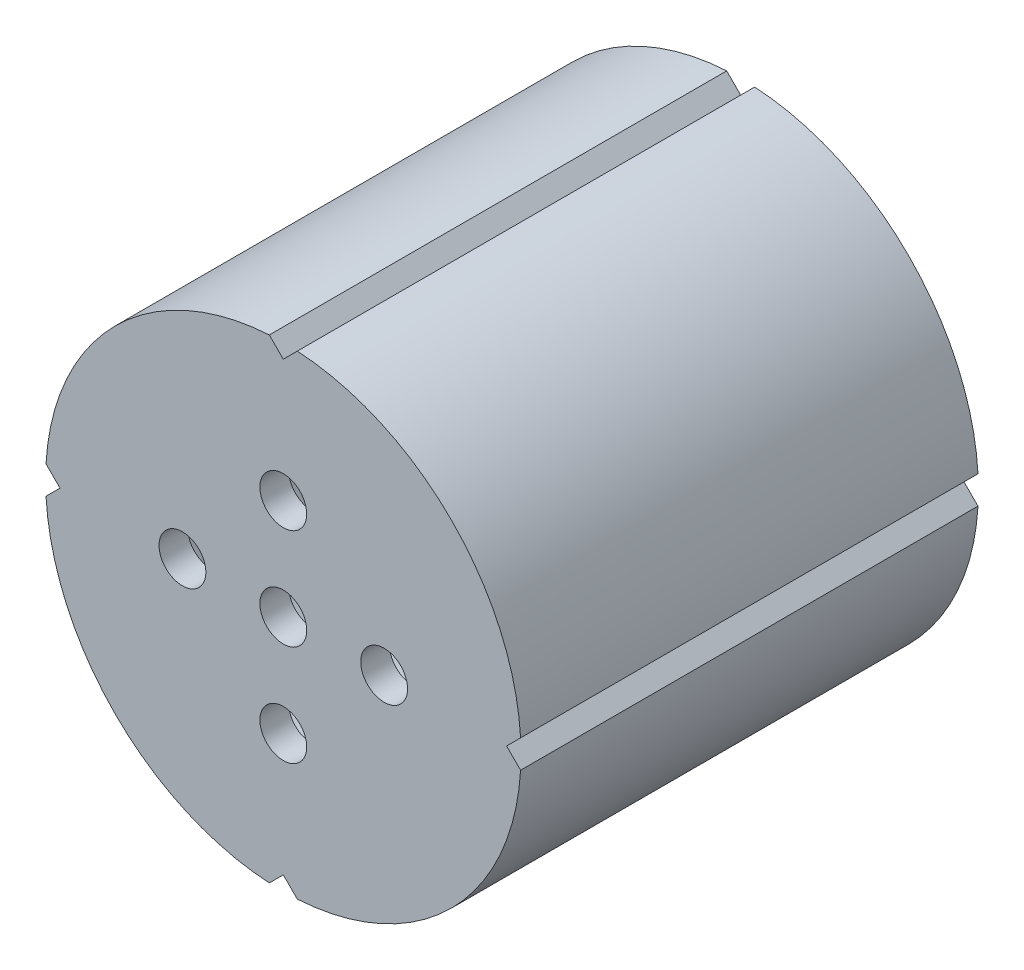
ISO-10303-21;
HEADER;
FILE_DESCRIPTION(('STEP AP214'),'2;1');
FILE_NAME('part.step','',(''),(''),'','','');
FILE_SCHEMA(('AUTOMOTIVE_DESIGN { 1 0 10303 214 1 1 1 1 }'));
ENDSEC;
DATA;
#1=APPLICATION_CONTEXT('core data for automotive mechanical design processes');
#2=APPLICATION_PROTOCOL_DEFINITION('international standard','automotive_design',2000,#1);
#3=PRODUCT_CONTEXT('',#1,'mechanical');
#4=PRODUCT('Part','Part','',(#3));
#5=PRODUCT_RELATED_PRODUCT_CATEGORY('part','',(#4));
#6=PRODUCT_DEFINITION_FORMATION('','',#4);
#7=PRODUCT_DEFINITION_CONTEXT('part definition',#1,'design');
#8=PRODUCT_DEFINITION('design','',#6,#7);
#9=PRODUCT_DEFINITION_SHAPE('','',#8);
#10=(LENGTH_UNIT() NAMED_UNIT(*) SI_UNIT(.MILLI.,.METRE.));
#11=(NAMED_UNIT(*) PLANE_ANGLE_UNIT() SI_UNIT($,.RADIAN.));
#12=(NAMED_UNIT(*) SI_UNIT($,.STERADIAN.) SOLID_ANGLE_UNIT());
#13=UNCERTAINTY_MEASURE_WITH_UNIT(LENGTH_MEASURE(1.E-05),#10,'distance_accuracy_value','');
#14=(GEOMETRIC_REPRESENTATION_CONTEXT(3) GLOBAL_UNCERTAINTY_ASSIGNED_CONTEXT((#13)) GLOBAL_UNIT_ASSIGNED_CONTEXT((#10,
#11,#12)) REPRESENTATION_CONTEXT('',''));
#15=CARTESIAN_POINT('',(0.,0.,0.));
#16=DIRECTION('',(0.,0.,1.));
#17=DIRECTION('',(1.,0.,0.));
#18=AXIS2_PLACEMENT_3D('',#15,#16,#17);
#19=CARTESIAN_POINT('',(4.97633536173072,-25.8000000000002,0.));
#20=DIRECTION('',(0.,0.,1.));
#21=DIRECTION('',(1.,0.,0.));
#22=AXIS2_PLACEMENT_3D('',#19,#20,#21);
#23=PLANE('',#22);
#24=CARTESIAN_POINT('',(4.97633536173072,-32.8000000000003,0.));
#25=DIRECTION('',(0.,0.,1.));
#26=DIRECTION('',(1.,0.,0.));
#27=AXIS2_PLACEMENT_3D('',#24,#25,#26);
#28=CIRCLE('',#27,1.625);
#29=CARTESIAN_POINT('',(6.60133536173072,-32.8000000000003,0.));
#30=VERTEX_POINT('',#29);
#31=EDGE_CURVE('E176',#30,#30,#28,.T.);
#32=ORIENTED_EDGE('',*,*,#31,.T.);
#33=EDGE_LOOP('',(#32));
#34=FACE_BOUND('',#33,.T.);
#35=CARTESIAN_POINT('',(11.9763353617307,-25.8000000000002,0.));
#36=DIRECTION('',(0.,0.,1.));
#37=DIRECTION('',(1.,0.,0.));
#38=AXIS2_PLACEMENT_3D('',#35,#36,#37);
#39=CIRCLE('',#38,1.625);
#40=CARTESIAN_POINT('',(13.6013353617307,-25.8000000000002,0.));
#41=VERTEX_POINT('',#40);
#42=EDGE_CURVE('E180',#41,#41,#39,.T.);
#43=ORIENTED_EDGE('',*,*,#42,.T.);
#44=EDGE_LOOP('',(#43));
#45=FACE_BOUND('',#44,.T.);
#46=CARTESIAN_POINT('',(4.97633536173072,-18.8000000000002,0.));
#47=DIRECTION('',(0.,0.,1.));
#48=DIRECTION('',(1.,0.,0.));
#49=AXIS2_PLACEMENT_3D('',#46,#47,#48);
#50=CIRCLE('',#49,1.625);
#51=CARTESIAN_POINT('',(6.60133536173072,-18.8000000000002,0.));
#52=VERTEX_POINT('',#51);
#53=EDGE_CURVE('E186',#52,#52,#50,.T.);
#54=ORIENTED_EDGE('',*,*,#53,.T.);
#55=EDGE_LOOP('',(#54));
#56=FACE_BOUND('',#55,.T.);
#57=CARTESIAN_POINT('',(-2.02366463826928,-25.8000000000002,0.));
#58=DIRECTION('',(0.,0.,1.));
#59=DIRECTION('',(1.,0.,0.));
#60=AXIS2_PLACEMENT_3D('',#57,#58,#59);
#61=CIRCLE('',#60,1.625);
#62=CARTESIAN_POINT('',(-0.398664638269278,-25.8000000000002,0.));
#63=VERTEX_POINT('',#62);
#64=EDGE_CURVE('E192',#63,#63,#61,.T.);
#65=ORIENTED_EDGE('',*,*,#64,.T.);
#66=EDGE_LOOP('',(#65));
#67=FACE_BOUND('',#66,.T.);
#68=CARTESIAN_POINT('',(4.97633536173072,-25.8000000000002,0.));
#69=DIRECTION('',(0.,0.,1.));
#70=DIRECTION('',(1.,0.,0.));
#71=AXIS2_PLACEMENT_3D('',#68,#69,#70);
#72=CIRCLE('',#71,1.625);
#73=CARTESIAN_POINT('',(6.60133536173072,-25.8000000000002,0.));
#74=VERTEX_POINT('',#73);
#75=EDGE_CURVE('E198',#74,#74,#72,.T.);
#76=ORIENTED_EDGE('',*,*,#75,.T.);
#77=EDGE_LOOP('',(#76));
#78=FACE_BOUND('',#77,.T.);
#79=CARTESIAN_POINT('',(4.97633536173074,-25.8000000000003,0.));
#80=DIRECTION('',(0.,0.,-1.));
#81=DIRECTION('',(-1.,0.,0.));
#82=AXIS2_PLACEMENT_3D('',#79,#80,#81);
#83=CIRCLE('',#82,14.9999999999991);
#84=CARTESIAN_POINT('',(-10.0236646382684,-25.8000000000003,0.));
#85=VERTEX_POINT('',#84);
#86=EDGE_CURVE('E147',#85,#85,#83,.T.);
#87=ORIENTED_EDGE('',*,*,#86,.T.);
#88=EDGE_LOOP('',(#87));
#89=FACE_BOUND('',#88,.T.);
#90=ADVANCED_FACE('F33',(#34,#45,#56,#67,#78,#89),#23,.F.);
#91=CARTESIAN_POINT('',(4.97633536173072,-25.8000000000002,2.));
#92=DIRECTION('',(0.,0.,1.));
#93=DIRECTION('',(1.,0.,0.));
#94=AXIS2_PLACEMENT_3D('',#91,#92,#93);
#95=PLANE('',#94);
#96=CARTESIAN_POINT('',(11.9763353617307,-25.8000000000002,2.));
#97=DIRECTION('',(0.,0.,1.));
#98=DIRECTION('',(1.,0.,0.));
#99=AXIS2_PLACEMENT_3D('',#96,#97,#98);
#100=CIRCLE('',#99,1.625);
#101=CARTESIAN_POINT('',(13.6013353617307,-25.8000000000002,2.));
#102=VERTEX_POINT('',#101);
#103=EDGE_CURVE('E183',#102,#102,#100,.T.);
#104=ORIENTED_EDGE('',*,*,#103,.F.);
#105=EDGE_LOOP('',(#104));
#106=FACE_BOUND('',#105,.T.);
#107=CARTESIAN_POINT('',(-2.02366463826928,-25.8000000000002,2.));
#108=DIRECTION('',(0.,0.,1.));
#109=DIRECTION('',(1.,0.,0.));
#110=AXIS2_PLACEMENT_3D('',#107,#108,#109);
#111=CIRCLE('',#110,1.625);
#112=CARTESIAN_POINT('',(-0.398664638269278,-25.8000000000002,2.));
#113=VERTEX_POINT('',#112);
#114=EDGE_CURVE('E195',#113,#113,#111,.T.);
#115=ORIENTED_EDGE('',*,*,#114,.F.);
#116=EDGE_LOOP('',(#115));
#117=FACE_BOUND('',#116,.T.);
#118=CARTESIAN_POINT('',(4.97633536173072,-25.8000000000002,2.));
#119=DIRECTION('',(0.,0.,1.));
#120=DIRECTION('',(1.,0.,0.));
#121=AXIS2_PLACEMENT_3D('',#118,#119,#120);
#122=CIRCLE('',#121,16.5);
#123=CARTESIAN_POINT('',(4.00495359047452,-9.32861822874404,2.));
#124=VERTEX_POINT('',#123);
#125=CARTESIAN_POINT('',(-11.4950464095255,-24.8286182287441,2.));
#126=VERTEX_POINT('',#125);
#127=EDGE_CURVE('E126',#124,#126,#122,.T.);
#128=ORIENTED_EDGE('',*,*,#127,.T.);
#129=DIRECTION('',(0.707106781186553,-0.707106781186542,0.));
#130=VECTOR('',#129,1.);
#131=CARTESIAN_POINT('',(-11.4950464095255,-24.8286182287441,2.));
#132=LINE('',#131,#130);
#133=CARTESIAN_POINT('',(-10.5236646382693,-25.8000000000002,2.));
#134=VERTEX_POINT('',#133);
#135=EDGE_CURVE('E207',#126,#134,#132,.T.);
#136=ORIENTED_EDGE('',*,*,#135,.T.);
#137=DIRECTION('',(-0.707106781186541,-0.707106781186555,0.));
#138=VECTOR('',#137,1.);
#139=CARTESIAN_POINT('',(-11.4950464095255,-26.7713817712565,2.));
#140=LINE('',#139,#138);
#141=CARTESIAN_POINT('',(-11.4950464095255,-26.7713817712565,2.));
#142=VERTEX_POINT('',#141);
#143=EDGE_CURVE('E209',#134,#142,#140,.T.);
#144=ORIENTED_EDGE('',*,*,#143,.T.);
#145=CARTESIAN_POINT('',(4.97633536173072,-25.8000000000002,2.));
#146=DIRECTION('',(0.,0.,1.));
#147=DIRECTION('',(1.,0.,0.));
#148=AXIS2_PLACEMENT_3D('',#145,#146,#147);
#149=CIRCLE('',#148,16.5);
#150=CARTESIAN_POINT('',(4.00495359047451,-42.2713817712565,2.));
#151=VERTEX_POINT('',#150);
#152=EDGE_CURVE('E211',#142,#151,#149,.T.);
#153=ORIENTED_EDGE('',*,*,#152,.T.);
#154=DIRECTION('',(0.707106781186551,0.707106781186544,0.));
#155=VECTOR('',#154,1.);
#156=CARTESIAN_POINT('',(4.00495359047451,-42.2713817712565,2.));
#157=LINE('',#156,#155);
#158=CARTESIAN_POINT('',(4.97633536173072,-41.3000000000002,2.));
#159=VERTEX_POINT('',#158);
#160=EDGE_CURVE('E213',#151,#159,#157,.T.);
#161=ORIENTED_EDGE('',*,*,#160,.T.);
#162=DIRECTION('',(0.707106781186547,-0.707106781186548,0.));
#163=VECTOR('',#162,1.);
#164=CARTESIAN_POINT('',(5.94771713298693,-42.2713817712565,2.));
#165=LINE('',#164,#163);
#166=CARTESIAN_POINT('',(5.94771713298693,-42.2713817712565,2.));
#167=VERTEX_POINT('',#166);
#168=EDGE_CURVE('E215',#159,#167,#165,.T.);
#169=ORIENTED_EDGE('',*,*,#168,.T.);
#170=CARTESIAN_POINT('',(4.97633536173072,-25.8000000000002,2.));
#171=DIRECTION('',(0.,0.,1.));
#172=DIRECTION('',(1.,0.,0.));
#173=AXIS2_PLACEMENT_3D('',#170,#171,#172);
#174=CIRCLE('',#173,16.5);
#175=CARTESIAN_POINT('',(21.4477171329869,-26.7713817712565,2.));
#176=VERTEX_POINT('',#175);
#177=EDGE_CURVE('E217',#167,#176,#174,.T.);
#178=ORIENTED_EDGE('',*,*,#177,.T.);
#179=DIRECTION('',(-0.707106781186549,0.707106781186546,0.));
#180=VECTOR('',#179,1.);
#181=CARTESIAN_POINT('',(21.4477171329869,-26.7713817712565,2.));
#182=LINE('',#181,#180);
#183=CARTESIAN_POINT('',(20.4763353617307,-25.8000000000002,2.));
#184=VERTEX_POINT('',#183);
#185=EDGE_CURVE('E219',#176,#184,#182,.T.);
#186=ORIENTED_EDGE('',*,*,#185,.T.);
#187=DIRECTION('',(0.707106781186546,0.707106781186549,0.));
#188=VECTOR('',#187,1.);
#189=CARTESIAN_POINT('',(21.4477171329869,-24.828618228744,2.));
#190=LINE('',#189,#188);
#191=CARTESIAN_POINT('',(21.4477171329869,-24.828618228744,2.));
#192=VERTEX_POINT('',#191);
#193=EDGE_CURVE('E221',#184,#192,#190,.T.);
#194=ORIENTED_EDGE('',*,*,#193,.T.);
#195=CARTESIAN_POINT('',(4.97633536173072,-25.8000000000002,2.));
#196=DIRECTION('',(0.,0.,1.));
#197=DIRECTION('',(1.,0.,0.));
#198=AXIS2_PLACEMENT_3D('',#195,#196,#197);
#199=CIRCLE('',#198,16.5);
#200=CARTESIAN_POINT('',(5.94771713298693,-9.32861822874405,2.));
#201=VERTEX_POINT('',#200);
#202=EDGE_CURVE('E223',#192,#201,#199,.T.);
#203=ORIENTED_EDGE('',*,*,#202,.T.);
#204=DIRECTION('',(-0.707106781186549,-0.707106781186546,0.));
#205=VECTOR('',#204,1.);
#206=CARTESIAN_POINT('',(5.94771713298693,-9.32861822874405,2.));
#207=LINE('',#206,#205);
#208=CARTESIAN_POINT('',(4.97633536173072,-10.3000000000003,2.));
#209=VERTEX_POINT('',#208);
#210=EDGE_CURVE('E53',#201,#209,#207,.T.);
#211=ORIENTED_EDGE('',*,*,#210,.T.);
#212=DIRECTION('',(-0.707106781186547,0.707106781186547,0.));
#213=VECTOR('',#212,1.);
#214=CARTESIAN_POINT('',(4.97633536173072,-10.3000000000003,2.));
#215=LINE('',#214,#213);
#216=EDGE_CURVE('E48',#209,#124,#215,.T.);
#217=ORIENTED_EDGE('',*,*,#216,.T.);
#218=EDGE_LOOP('',(#128,#136,#144,#153,#161,#169,#178,#186,#194,#203,#211,#217));
#219=FACE_BOUND('',#218,.T.);
#220=CARTESIAN_POINT('',(4.97633536173072,-25.8000000000002,2.));
#221=DIRECTION('',(0.,0.,1.));
#222=DIRECTION('',(1.,0.,0.));
#223=AXIS2_PLACEMENT_3D('',#220,#221,#222);
#224=CIRCLE('',#223,1.625);
#225=CARTESIAN_POINT('',(6.60133536173072,-25.8000000000002,2.));
#226=VERTEX_POINT('',#225);
#227=EDGE_CURVE('E201',#226,#226,#224,.T.);
#228=ORIENTED_EDGE('',*,*,#227,.F.);
#229=EDGE_LOOP('',(#228));
#230=FACE_BOUND('',#229,.T.);
#231=CARTESIAN_POINT('',(4.97633536173072,-18.8000000000002,2.));
#232=DIRECTION('',(0.,0.,1.));
#233=DIRECTION('',(1.,0.,0.));
#234=AXIS2_PLACEMENT_3D('',#231,#232,#233);
#235=CIRCLE('',#234,1.625);
#236=CARTESIAN_POINT('',(6.60133536173072,-18.8000000000002,2.));
#237=VERTEX_POINT('',#236);
#238=EDGE_CURVE('E189',#237,#237,#235,.T.);
#239=ORIENTED_EDGE('',*,*,#238,.F.);
#240=EDGE_LOOP('',(#239));
#241=FACE_BOUND('',#240,.T.);
#242=CARTESIAN_POINT('',(4.97633536173072,-32.8000000000003,2.));
#243=DIRECTION('',(0.,0.,1.));
#244=DIRECTION('',(1.,0.,0.));
#245=AXIS2_PLACEMENT_3D('',#242,#243,#244);
#246=CIRCLE('',#245,1.625);
#247=CARTESIAN_POINT('',(6.60133536173072,-32.8000000000003,2.));
#248=VERTEX_POINT('',#247);
#249=EDGE_CURVE('E177',#248,#248,#246,.T.);
#250=ORIENTED_EDGE('',*,*,#249,.F.);
#251=EDGE_LOOP('',(#250));
#252=FACE_BOUND('',#251,.T.);
#253=ADVANCED_FACE('F252',(#106,#117,#219,#230,#241,#252),#95,.T.);
#254=CARTESIAN_POINT('',(4.97633536173072,-25.8000000000002,2.));
#255=DIRECTION('',(0.,0.,-1.));
#256=DIRECTION('',(-1.,0.,0.));
#257=AXIS2_PLACEMENT_3D('',#254,#255,#256);
#258=CYLINDRICAL_SURFACE('',#257,16.5);
#259=DIRECTION('',(0.,0.,-1.));
#260=VECTOR('',#259,1.);
#261=CARTESIAN_POINT('',(4.00495359047452,-9.32861822874404,2.));
#262=LINE('',#261,#260);
#263=CARTESIAN_POINT('',(4.00495359047452,-9.32861822874404,-29.75));
#264=VERTEX_POINT('',#263);
#265=EDGE_CURVE('E121',#124,#264,#262,.T.);
#266=ORIENTED_EDGE('',*,*,#265,.T.);
#267=CARTESIAN_POINT('',(4.97633536173074,-25.8000000000003,-29.75));
#268=DIRECTION('',(0.,0.,-1.));
#269=DIRECTION('',(1.,0.,0.));
#270=AXIS2_PLACEMENT_3D('',#267,#268,#269);
#271=CIRCLE('',#270,16.5);
#272=CARTESIAN_POINT('',(-11.4950464095255,-24.8286182287441,-29.75));
#273=VERTEX_POINT('',#272);
#274=EDGE_CURVE('E125',#273,#264,#271,.T.);
#275=ORIENTED_EDGE('',*,*,#274,.F.);
#276=DIRECTION('',(0.,0.,-1.));
#277=VECTOR('',#276,1.);
#278=CARTESIAN_POINT('',(-11.4950464095255,-24.8286182287441,2.));
#279=LINE('',#278,#277);
#280=EDGE_CURVE('E11',#126,#273,#279,.T.);
#281=ORIENTED_EDGE('',*,*,#280,.F.);
#282=ORIENTED_EDGE('',*,*,#127,.F.);
#283=EDGE_LOOP('',(#266,#275,#281,#282));
#284=FACE_BOUND('',#283,.T.);
#285=ADVANCED_FACE('F35',(#284),#258,.T.);
#286=CARTESIAN_POINT('',(-11.4950464095255,-24.8286182287441,2.));
#287=DIRECTION('',(0.707106781186543,0.707106781186553,0.));
#288=DIRECTION('',(-0.707106781186553,0.707106781186543,0.));
#289=AXIS2_PLACEMENT_3D('',#286,#287,#288);
#290=PLANE('',#289);
#291=ORIENTED_EDGE('',*,*,#280,.T.);
#292=DIRECTION('',(-0.707106781186553,0.707106781186542,0.));
#293=VECTOR('',#292,1.);
#294=CARTESIAN_POINT('',(-11.4950464095255,-24.8286182287441,-29.75));
#295=LINE('',#294,#293);
#296=CARTESIAN_POINT('',(-10.5236646382693,-25.8000000000002,-29.75));
#297=VERTEX_POINT('',#296);
#298=EDGE_CURVE('E143',#297,#273,#295,.T.);
#299=ORIENTED_EDGE('',*,*,#298,.F.);
#300=DIRECTION('',(0.,0.,-1.));
#301=VECTOR('',#300,1.);
#302=CARTESIAN_POINT('',(-10.5236646382693,-25.8000000000002,2.));
#303=LINE('',#302,#301);
#304=EDGE_CURVE('E41',#134,#297,#303,.T.);
#305=ORIENTED_EDGE('',*,*,#304,.F.);
#306=ORIENTED_EDGE('',*,*,#135,.F.);
#307=EDGE_LOOP('',(#291,#299,#305,#306));
#308=FACE_BOUND('',#307,.T.);
#309=ADVANCED_FACE('F251',(#308),#290,.F.);
#310=CARTESIAN_POINT('',(-11.4950464095255,-26.7713817712565,2.));
#311=DIRECTION('',(0.707106781186555,-0.707106781186541,0.));
#312=DIRECTION('',(0.707106781186541,0.707106781186554,0.));
#313=AXIS2_PLACEMENT_3D('',#310,#311,#312);
#314=PLANE('',#313);
#315=ORIENTED_EDGE('',*,*,#304,.T.);
#316=DIRECTION('',(0.707106781186544,0.707106781186551,0.));
#317=VECTOR('',#316,1.);
#318=CARTESIAN_POINT('',(-10.5236646382693,-25.8000000000002,-29.75));
#319=LINE('',#318,#317);
#320=CARTESIAN_POINT('',(-11.4950464095255,-26.7713817712565,-29.75));
#321=VERTEX_POINT('',#320);
#322=EDGE_CURVE('E173',#321,#297,#319,.T.);
#323=ORIENTED_EDGE('',*,*,#322,.F.);
#324=DIRECTION('',(0.,0.,-1.));
#325=VECTOR('',#324,1.);
#326=CARTESIAN_POINT('',(-11.4950464095255,-26.7713817712565,2.));
#327=LINE('',#326,#325);
#328=EDGE_CURVE('E242',#142,#321,#327,.T.);
#329=ORIENTED_EDGE('',*,*,#328,.F.);
#330=ORIENTED_EDGE('',*,*,#143,.F.);
#331=EDGE_LOOP('',(#315,#323,#329,#330));
#332=FACE_BOUND('',#331,.T.);
#333=ADVANCED_FACE('F247',(#332),#314,.F.);
#334=CARTESIAN_POINT('',(4.97633536173072,-25.8000000000002,2.));
#335=DIRECTION('',(0.,0.,-1.));
#336=DIRECTION('',(-1.,0.,0.));
#337=AXIS2_PLACEMENT_3D('',#334,#335,#336);
#338=CYLINDRICAL_SURFACE('',#337,16.5);
#339=ORIENTED_EDGE('',*,*,#328,.T.);
#340=CARTESIAN_POINT('',(4.97633536173084,-25.8000000000001,-29.75));
#341=DIRECTION('',(0.,0.,-1.));
#342=DIRECTION('',(1.,0.,0.));
#343=AXIS2_PLACEMENT_3D('',#340,#341,#342);
#344=CIRCLE('',#343,16.5000000000001);
#345=CARTESIAN_POINT('',(4.00495359047451,-42.2713817712565,-29.75));
#346=VERTEX_POINT('',#345);
#347=EDGE_CURVE('E170',#346,#321,#344,.T.);
#348=ORIENTED_EDGE('',*,*,#347,.F.);
#349=DIRECTION('',(0.,0.,-1.));
#350=VECTOR('',#349,1.);
#351=CARTESIAN_POINT('',(4.00495359047451,-42.2713817712565,2.));
#352=LINE('',#351,#350);
#353=EDGE_CURVE('E240',#151,#346,#352,.T.);
#354=ORIENTED_EDGE('',*,*,#353,.F.);
#355=ORIENTED_EDGE('',*,*,#152,.F.);
#356=EDGE_LOOP('',(#339,#348,#354,#355));
#357=FACE_BOUND('',#356,.T.);
#358=ADVANCED_FACE('F337',(#357),#338,.T.);
#359=CARTESIAN_POINT('',(4.00495359047451,-42.2713817712565,2.));
#360=DIRECTION('',(-0.707106781186544,0.707106781186551,0.));
#361=DIRECTION('',(-0.707106781186551,-0.707106781186544,0.));
#362=AXIS2_PLACEMENT_3D('',#359,#360,#361);
#363=PLANE('',#362);
#364=ORIENTED_EDGE('',*,*,#353,.T.);
#365=DIRECTION('',(-0.707106781186551,-0.707106781186544,0.));
#366=VECTOR('',#365,1.);
#367=CARTESIAN_POINT('',(4.00495359047451,-42.2713817712565,-29.75));
#368=LINE('',#367,#366);
#369=CARTESIAN_POINT('',(4.97633536173072,-41.3000000000002,-29.75));
#370=VERTEX_POINT('',#369);
#371=EDGE_CURVE('E167',#370,#346,#368,.T.);
#372=ORIENTED_EDGE('',*,*,#371,.F.);
#373=DIRECTION('',(0.,0.,-1.));
#374=VECTOR('',#373,1.);
#375=CARTESIAN_POINT('',(4.97633536173072,-41.3000000000002,2.));
#376=LINE('',#375,#374);
#377=EDGE_CURVE('E238',#159,#370,#376,.T.);
#378=ORIENTED_EDGE('',*,*,#377,.F.);
#379=ORIENTED_EDGE('',*,*,#160,.F.);
#380=EDGE_LOOP('',(#364,#372,#378,#379));
#381=FACE_BOUND('',#380,.T.);
#382=ADVANCED_FACE('F333',(#381),#363,.F.);
#383=CARTESIAN_POINT('',(5.94771713298693,-42.2713817712565,2.));
#384=DIRECTION('',(0.707106781186548,0.707106781186547,0.));
#385=DIRECTION('',(-0.707106781186547,0.707106781186548,0.));
#386=AXIS2_PLACEMENT_3D('',#383,#384,#385);
#387=PLANE('',#386);
#388=ORIENTED_EDGE('',*,*,#377,.T.);
#389=DIRECTION('',(-0.707106781186545,0.70710678118655,0.));
#390=VECTOR('',#389,1.);
#391=CARTESIAN_POINT('',(4.97633536173072,-41.3000000000002,-29.75));
#392=LINE('',#391,#390);
#393=CARTESIAN_POINT('',(5.94771713298693,-42.2713817712565,-29.75));
#394=VERTEX_POINT('',#393);
#395=EDGE_CURVE('E164',#394,#370,#392,.T.);
#396=ORIENTED_EDGE('',*,*,#395,.F.);
#397=DIRECTION('',(0.,0.,-1.));
#398=VECTOR('',#397,1.);
#399=CARTESIAN_POINT('',(5.94771713298693,-42.2713817712565,2.));
#400=LINE('',#399,#398);
#401=EDGE_CURVE('E236',#167,#394,#400,.T.);
#402=ORIENTED_EDGE('',*,*,#401,.F.);
#403=ORIENTED_EDGE('',*,*,#168,.F.);
#404=EDGE_LOOP('',(#388,#396,#402,#403));
#405=FACE_BOUND('',#404,.T.);
#406=ADVANCED_FACE('F329',(#405),#387,.F.);
#407=CARTESIAN_POINT('',(4.97633536173072,-25.8000000000002,2.));
#408=DIRECTION('',(0.,0.,-1.));
#409=DIRECTION('',(-1.,0.,0.));
#410=AXIS2_PLACEMENT_3D('',#407,#408,#409);
#411=CYLINDRICAL_SURFACE('',#410,16.5);
#412=ORIENTED_EDGE('',*,*,#401,.T.);
#413=CARTESIAN_POINT('',(4.97633536173062,-25.8000000000002,-29.75));
#414=DIRECTION('',(0.,0.,-1.));
#415=DIRECTION('',(1.,0.,0.));
#416=AXIS2_PLACEMENT_3D('',#413,#414,#415);
#417=CIRCLE('',#416,16.5000000000001);
#418=CARTESIAN_POINT('',(21.4477171329869,-26.7713817712565,-29.75));
#419=VERTEX_POINT('',#418);
#420=EDGE_CURVE('E161',#419,#394,#417,.T.);
#421=ORIENTED_EDGE('',*,*,#420,.F.);
#422=DIRECTION('',(0.,0.,-1.));
#423=VECTOR('',#422,1.);
#424=CARTESIAN_POINT('',(21.4477171329869,-26.7713817712565,2.));
#425=LINE('',#424,#423);
#426=EDGE_CURVE('E234',#176,#419,#425,.T.);
#427=ORIENTED_EDGE('',*,*,#426,.F.);
#428=ORIENTED_EDGE('',*,*,#177,.F.);
#429=EDGE_LOOP('',(#412,#421,#427,#428));
#430=FACE_BOUND('',#429,.T.);
#431=ADVANCED_FACE('F325',(#430),#411,.T.);
#432=CARTESIAN_POINT('',(21.4477171329869,-26.7713817712565,2.));
#433=DIRECTION('',(-0.707106781186546,-0.707106781186549,0.));
#434=DIRECTION('',(0.707106781186549,-0.707106781186546,0.));
#435=AXIS2_PLACEMENT_3D('',#432,#433,#434);
#436=PLANE('',#435);
#437=ORIENTED_EDGE('',*,*,#426,.T.);
#438=DIRECTION('',(0.707106781186549,-0.707106781186546,0.));
#439=VECTOR('',#438,1.);
#440=CARTESIAN_POINT('',(20.4763353617307,-25.8000000000002,-29.75));
#441=LINE('',#440,#439);
#442=CARTESIAN_POINT('',(20.4763353617307,-25.8000000000002,-29.75));
#443=VERTEX_POINT('',#442);
#444=EDGE_CURVE('E158',#443,#419,#441,.T.);
#445=ORIENTED_EDGE('',*,*,#444,.F.);
#446=DIRECTION('',(0.,0.,-1.));
#447=VECTOR('',#446,1.);
#448=CARTESIAN_POINT('',(20.4763353617307,-25.8000000000002,2.));
#449=LINE('',#448,#447);
#450=EDGE_CURVE('E232',#184,#443,#449,.T.);
#451=ORIENTED_EDGE('',*,*,#450,.F.);
#452=ORIENTED_EDGE('',*,*,#185,.F.);
#453=EDGE_LOOP('',(#437,#445,#451,#452));
#454=FACE_BOUND('',#453,.T.);
#455=ADVANCED_FACE('F321',(#454),#436,.F.);
#456=CARTESIAN_POINT('',(21.4477171329869,-24.828618228744,2.));
#457=DIRECTION('',(-0.707106781186549,0.707106781186546,0.));
#458=DIRECTION('',(-0.707106781186546,-0.707106781186549,0.));
#459=AXIS2_PLACEMENT_3D('',#456,#457,#458);
#460=PLANE('',#459);
#461=ORIENTED_EDGE('',*,*,#450,.T.);
#462=DIRECTION('',(-0.707106781186546,-0.707106781186549,0.));
#463=VECTOR('',#462,1.);
#464=CARTESIAN_POINT('',(21.4477171329869,-24.828618228744,-29.75));
#465=LINE('',#464,#463);
#466=CARTESIAN_POINT('',(21.4477171329869,-24.828618228744,-29.75));
#467=VERTEX_POINT('',#466);
#468=EDGE_CURVE('E155',#467,#443,#465,.T.);
#469=ORIENTED_EDGE('',*,*,#468,.F.);
#470=DIRECTION('',(0.,0.,-1.));
#471=VECTOR('',#470,1.);
#472=CARTESIAN_POINT('',(21.4477171329869,-24.828618228744,2.));
#473=LINE('',#472,#471);
#474=EDGE_CURVE('E230',#192,#467,#473,.T.);
#475=ORIENTED_EDGE('',*,*,#474,.F.);
#476=ORIENTED_EDGE('',*,*,#193,.F.);
#477=EDGE_LOOP('',(#461,#469,#475,#476));
#478=FACE_BOUND('',#477,.T.);
#479=ADVANCED_FACE('F317',(#478),#460,.F.);
#480=CARTESIAN_POINT('',(4.97633536173072,-25.8000000000002,2.));
#481=DIRECTION('',(0.,0.,-1.));
#482=DIRECTION('',(-1.,0.,0.));
#483=AXIS2_PLACEMENT_3D('',#480,#481,#482);
#484=CYLINDRICAL_SURFACE('',#483,16.5);
#485=ORIENTED_EDGE('',*,*,#474,.T.);
#486=CARTESIAN_POINT('',(4.97633536173074,-25.8000000000002,-29.75));
#487=DIRECTION('',(0.,0.,-1.));
#488=DIRECTION('',(1.,0.,0.));
#489=AXIS2_PLACEMENT_3D('',#486,#487,#488);
#490=CIRCLE('',#489,16.5);
#491=CARTESIAN_POINT('',(5.94771713298693,-9.32861822874405,-29.75));
#492=VERTEX_POINT('',#491);
#493=EDGE_CURVE('E152',#492,#467,#490,.T.);
#494=ORIENTED_EDGE('',*,*,#493,.F.);
#495=DIRECTION('',(0.,0.,-1.));
#496=VECTOR('',#495,1.);
#497=CARTESIAN_POINT('',(5.94771713298693,-9.32861822874405,2.));
#498=LINE('',#497,#496);
#499=EDGE_CURVE('E228',#201,#492,#498,.T.);
#500=ORIENTED_EDGE('',*,*,#499,.F.);
#501=ORIENTED_EDGE('',*,*,#202,.F.);
#502=EDGE_LOOP('',(#485,#494,#500,#501));
#503=FACE_BOUND('',#502,.T.);
#504=ADVANCED_FACE('F313',(#503),#484,.T.);
#505=CARTESIAN_POINT('',(5.94771713298693,-9.32861822874405,2.));
#506=DIRECTION('',(0.707106781186546,-0.707106781186549,0.));
#507=DIRECTION('',(0.707106781186549,0.707106781186546,0.));
#508=AXIS2_PLACEMENT_3D('',#505,#506,#507);
#509=PLANE('',#508);
#510=ORIENTED_EDGE('',*,*,#499,.T.);
#511=DIRECTION('',(0.707106781186549,0.707106781186546,0.));
#512=VECTOR('',#511,1.);
#513=CARTESIAN_POINT('',(5.94771713298693,-9.32861822874405,-29.75));
#514=LINE('',#513,#512);
#515=CARTESIAN_POINT('',(4.97633536173072,-10.3000000000003,-29.75));
#516=VERTEX_POINT('',#515);
#517=EDGE_CURVE('E136',#516,#492,#514,.T.);
#518=ORIENTED_EDGE('',*,*,#517,.F.);
#519=DIRECTION('',(0.,0.,-1.));
#520=VECTOR('',#519,1.);
#521=CARTESIAN_POINT('',(4.97633536173072,-10.3000000000003,2.));
#522=LINE('',#521,#520);
#523=EDGE_CURVE('E128',#209,#516,#522,.T.);
#524=ORIENTED_EDGE('',*,*,#523,.F.);
#525=ORIENTED_EDGE('',*,*,#210,.F.);
#526=EDGE_LOOP('',(#510,#518,#524,#525));
#527=FACE_BOUND('',#526,.T.);
#528=ADVANCED_FACE('F310',(#527),#509,.F.);
#529=CARTESIAN_POINT('',(4.97633536173072,-10.3000000000003,2.));
#530=DIRECTION('',(-0.707106781186547,-0.707106781186547,0.));
#531=DIRECTION('',(0.707106781186548,-0.707106781186548,0.));
#532=AXIS2_PLACEMENT_3D('',#529,#530,#531);
#533=PLANE('',#532);
#534=ORIENTED_EDGE('',*,*,#523,.T.);
#535=DIRECTION('',(0.707106781186547,-0.707106781186547,0.));
#536=VECTOR('',#535,1.);
#537=CARTESIAN_POINT('',(4.97633536173072,-10.3000000000003,-29.75));
#538=LINE('',#537,#536);
#539=EDGE_CURVE('E131',#264,#516,#538,.T.);
#540=ORIENTED_EDGE('',*,*,#539,.F.);
#541=ORIENTED_EDGE('',*,*,#265,.F.);
#542=ORIENTED_EDGE('',*,*,#216,.F.);
#543=EDGE_LOOP('',(#534,#540,#541,#542));
#544=FACE_BOUND('',#543,.T.);
#545=ADVANCED_FACE('F132',(#544),#533,.F.);
#546=CARTESIAN_POINT('',(4.97633536173072,-25.8000000000002,2.));
#547=DIRECTION('',(0.,0.,-1.));
#548=DIRECTION('',(-1.,0.,0.));
#549=AXIS2_PLACEMENT_3D('',#546,#547,#548);
#550=CYLINDRICAL_SURFACE('',#549,1.625);
#551=ORIENTED_EDGE('',*,*,#227,.T.);
#552=EDGE_LOOP('',(#551));
#553=FACE_BOUND('',#552,.T.);
#554=ORIENTED_EDGE('',*,*,#75,.F.);
#555=EDGE_LOOP('',(#554));
#556=FACE_BOUND('',#555,.T.);
#557=ADVANCED_FACE('F303',(#553,#556),#550,.F.);
#558=CARTESIAN_POINT('',(-2.02366463826928,-25.8000000000002,2.));
#559=DIRECTION('',(0.,0.,-1.));
#560=DIRECTION('',(-1.,0.,0.));
#561=AXIS2_PLACEMENT_3D('',#558,#559,#560);
#562=CYLINDRICAL_SURFACE('',#561,1.625);
#563=ORIENTED_EDGE('',*,*,#114,.T.);
#564=EDGE_LOOP('',(#563));
#565=FACE_BOUND('',#564,.T.);
#566=ORIENTED_EDGE('',*,*,#64,.F.);
#567=EDGE_LOOP('',(#566));
#568=FACE_BOUND('',#567,.T.);
#569=ADVANCED_FACE('F299',(#565,#568),#562,.F.);
#570=CARTESIAN_POINT('',(4.97633536173072,-18.8000000000002,2.));
#571=DIRECTION('',(0.,0.,-1.));
#572=DIRECTION('',(-1.,0.,0.));
#573=AXIS2_PLACEMENT_3D('',#570,#571,#572);
#574=CYLINDRICAL_SURFACE('',#573,1.625);
#575=ORIENTED_EDGE('',*,*,#238,.T.);
#576=EDGE_LOOP('',(#575));
#577=FACE_BOUND('',#576,.T.);
#578=ORIENTED_EDGE('',*,*,#53,.F.);
#579=EDGE_LOOP('',(#578));
#580=FACE_BOUND('',#579,.T.);
#581=ADVANCED_FACE('F295',(#577,#580),#574,.F.);
#582=CARTESIAN_POINT('',(11.9763353617307,-25.8000000000002,2.));
#583=DIRECTION('',(0.,0.,-1.));
#584=DIRECTION('',(-1.,0.,0.));
#585=AXIS2_PLACEMENT_3D('',#582,#583,#584);
#586=CYLINDRICAL_SURFACE('',#585,1.625);
#587=ORIENTED_EDGE('',*,*,#103,.T.);
#588=EDGE_LOOP('',(#587));
#589=FACE_BOUND('',#588,.T.);
#590=ORIENTED_EDGE('',*,*,#42,.F.);
#591=EDGE_LOOP('',(#590));
#592=FACE_BOUND('',#591,.T.);
#593=ADVANCED_FACE('F266',(#589,#592),#586,.F.);
#594=CARTESIAN_POINT('',(4.97633536173072,-32.8000000000003,2.));
#595=DIRECTION('',(0.,0.,-1.));
#596=DIRECTION('',(-1.,0.,0.));
#597=AXIS2_PLACEMENT_3D('',#594,#595,#596);
#598=CYLINDRICAL_SURFACE('',#597,1.625);
#599=ORIENTED_EDGE('',*,*,#249,.T.);
#600=EDGE_LOOP('',(#599));
#601=FACE_BOUND('',#600,.T.);
#602=ORIENTED_EDGE('',*,*,#31,.F.);
#603=EDGE_LOOP('',(#602));
#604=FACE_BOUND('',#603,.T.);
#605=ADVANCED_FACE('F263',(#601,#604),#598,.F.);
#606=CARTESIAN_POINT('',(4.97633536173074,-25.8000000000003,-29.75));
#607=DIRECTION('',(0.,0.,1.));
#608=DIRECTION('',(1.,0.,0.));
#609=AXIS2_PLACEMENT_3D('',#606,#607,#608);
#610=PLANE('',#609);
#611=ORIENTED_EDGE('',*,*,#274,.T.);
#612=ORIENTED_EDGE('',*,*,#539,.T.);
#613=ORIENTED_EDGE('',*,*,#517,.T.);
#614=ORIENTED_EDGE('',*,*,#493,.T.);
#615=ORIENTED_EDGE('',*,*,#468,.T.);
#616=ORIENTED_EDGE('',*,*,#444,.T.);
#617=ORIENTED_EDGE('',*,*,#420,.T.);
#618=ORIENTED_EDGE('',*,*,#395,.T.);
#619=ORIENTED_EDGE('',*,*,#371,.T.);
#620=ORIENTED_EDGE('',*,*,#347,.T.);
#621=ORIENTED_EDGE('',*,*,#322,.T.);
#622=ORIENTED_EDGE('',*,*,#298,.T.);
#623=EDGE_LOOP('',(#611,#612,#613,#614,#615,#616,#617,#618,#619,#620,#621,#622));
#624=FACE_BOUND('',#623,.T.);
#625=CARTESIAN_POINT('',(4.97633536173074,-25.8000000000003,-29.75));
#626=DIRECTION('',(0.,0.,-1.));
#627=DIRECTION('',(-1.,0.,0.));
#628=AXIS2_PLACEMENT_3D('',#625,#626,#627);
#629=CIRCLE('',#628,14.9999999999991);
#630=CARTESIAN_POINT('',(-10.0236646382684,-25.8000000000003,-29.75));
#631=VERTEX_POINT('',#630);
#632=EDGE_CURVE('E144',#631,#631,#629,.T.);
#633=ORIENTED_EDGE('',*,*,#632,.F.);
#634=EDGE_LOOP('',(#633));
#635=FACE_BOUND('',#634,.T.);
#636=ADVANCED_FACE('F139',(#624,#635),#610,.F.);
#637=CARTESIAN_POINT('',(4.97633536173074,-25.8000000000003,-29.75));
#638=DIRECTION('',(0.,0.,1.));
#639=DIRECTION('',(1.,0.,0.));
#640=AXIS2_PLACEMENT_3D('',#637,#638,#639);
#641=CYLINDRICAL_SURFACE('',#640,14.9999999999991);
#642=ORIENTED_EDGE('',*,*,#632,.T.);
#643=EDGE_LOOP('',(#642));
#644=FACE_BOUND('',#643,.T.);
#645=ORIENTED_EDGE('',*,*,#86,.F.);
#646=EDGE_LOOP('',(#645));
#647=FACE_BOUND('',#646,.T.);
#648=ADVANCED_FACE('F284',(#644,#647),#641,.F.);
#649=CLOSED_SHELL('',(#90,#253,#285,#309,#333,#358,#382,#406,#431,#455,#479,#504,#528,#545,#557,
#569,#581,#593,#605,#636,#648));
#650=MANIFOLD_SOLID_BREP('B2',#649);
#651=ADVANCED_BREP_SHAPE_REPRESENTATION('',(#18,#650),#14);
#652=SHAPE_DEFINITION_REPRESENTATION(#9,#651);
ENDSEC;
END-ISO-10303-21;
